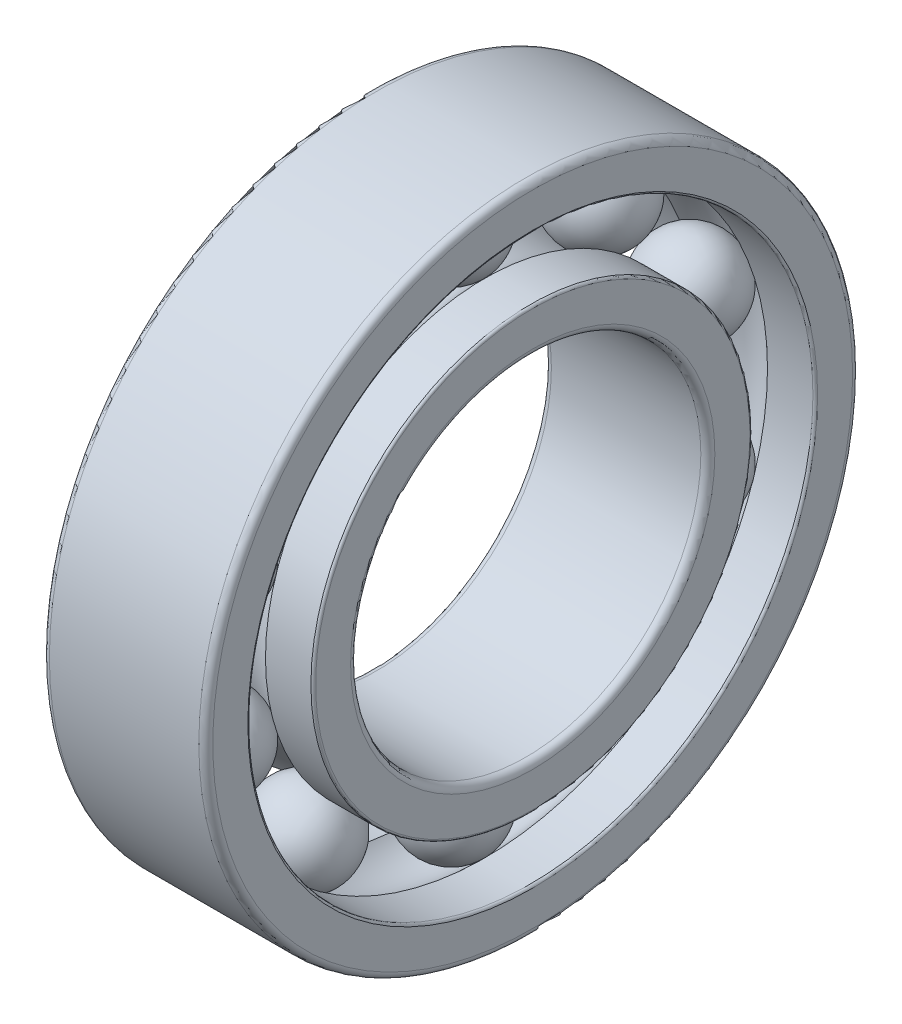
ISO-10303-21;
HEADER;
FILE_DESCRIPTION(('STEP AP214'),'2;1');
FILE_NAME('part.step','',(''),(''),'','','');
FILE_SCHEMA(('AUTOMOTIVE_DESIGN { 1 0 10303 214 1 1 1 1 }'));
ENDSEC;
DATA;
#1=APPLICATION_CONTEXT('core data for automotive mechanical design processes');
#2=APPLICATION_PROTOCOL_DEFINITION('international standard','automotive_design',2000,#1);
#3=PRODUCT_CONTEXT('',#1,'mechanical');
#4=PRODUCT('Part','Part','',(#3));
#5=PRODUCT_RELATED_PRODUCT_CATEGORY('part','',(#4));
#6=PRODUCT_DEFINITION_FORMATION('','',#4);
#7=PRODUCT_DEFINITION_CONTEXT('part definition',#1,'design');
#8=PRODUCT_DEFINITION('design','',#6,#7);
#9=PRODUCT_DEFINITION_SHAPE('','',#8);
#10=(LENGTH_UNIT() NAMED_UNIT(*) SI_UNIT(.MILLI.,.METRE.));
#11=(NAMED_UNIT(*) PLANE_ANGLE_UNIT() SI_UNIT($,.RADIAN.));
#12=(NAMED_UNIT(*) SI_UNIT($,.STERADIAN.) SOLID_ANGLE_UNIT());
#13=UNCERTAINTY_MEASURE_WITH_UNIT(LENGTH_MEASURE(1.E-05),#10,'distance_accuracy_value','');
#14=(GEOMETRIC_REPRESENTATION_CONTEXT(3) GLOBAL_UNCERTAINTY_ASSIGNED_CONTEXT((#13)) GLOBAL_UNIT_ASSIGNED_CONTEXT((#10,
#11,#12)) REPRESENTATION_CONTEXT('',''));
#15=CARTESIAN_POINT('',(0.,0.,0.));
#16=DIRECTION('',(0.,0.,1.));
#17=DIRECTION('',(1.,0.,0.));
#18=AXIS2_PLACEMENT_3D('',#15,#16,#17);
#19=CARTESIAN_POINT('',(3.5,8.696932689531,-6.3186914621441));
#20=DIRECTION('',(-1.,0.,0.));
#21=DIRECTION('',(0.,-1.,0.));
#22=AXIS2_PLACEMENT_3D('',#19,#20,#21);
#23=SPHERICAL_SURFACE('',#22,1.9845);
#24=CARTESIAN_POINT('',(1.5155,8.696932689531,-6.3186914621441));
#25=VERTEX_POINT('',#24);
#26=VERTEX_LOOP('',#25);
#27=FACE_BOUND('',#26,.T.);
#28=ADVANCED_FACE('P0_F13',(#27),#23,.T.);
#29=CLOSED_SHELL('',(#28));
#30=MANIFOLD_SOLID_BREP('P0_B1',#29);
#31=CARTESIAN_POINT('',(3.5,10.75,0.));
#32=DIRECTION('',(-1.,0.,0.));
#33=DIRECTION('',(0.,-1.,0.));
#34=AXIS2_PLACEMENT_3D('',#31,#32,#33);
#35=SPHERICAL_SURFACE('',#34,1.9845);
#36=CARTESIAN_POINT('',(1.5155,10.75,0.));
#37=VERTEX_POINT('',#36);
#38=VERTEX_LOOP('',#37);
#39=FACE_BOUND('',#38,.T.);
#40=ADVANCED_FACE('P1_F13',(#39),#35,.T.);
#41=CLOSED_SHELL('',(#40));
#42=MANIFOLD_SOLID_BREP('P1_B1',#41);
#43=CARTESIAN_POINT('',(3.5,3.321932689531,-10.223857550173));
#44=DIRECTION('',(-1.,0.,0.));
#45=DIRECTION('',(0.,-1.,0.));
#46=AXIS2_PLACEMENT_3D('',#43,#44,#45);
#47=SPHERICAL_SURFACE('',#46,1.9845);
#48=CARTESIAN_POINT('',(1.5155,3.321932689531,-10.223857550173));
#49=VERTEX_POINT('',#48);
#50=VERTEX_LOOP('',#49);
#51=FACE_BOUND('',#50,.T.);
#52=ADVANCED_FACE('P2_F13',(#51),#47,.T.);
#53=CLOSED_SHELL('',(#52));
#54=MANIFOLD_SOLID_BREP('P2_B1',#53);
#55=CARTESIAN_POINT('',(3.5,-3.3219326895307,-10.223857550173));
#56=DIRECTION('',(-1.,0.,0.));
#57=DIRECTION('',(0.,-1.,0.));
#58=AXIS2_PLACEMENT_3D('',#55,#56,#57);
#59=SPHERICAL_SURFACE('',#58,1.9845);
#60=CARTESIAN_POINT('',(1.5155,-3.3219326895307,-10.223857550173));
#61=VERTEX_POINT('',#60);
#62=VERTEX_LOOP('',#61);
#63=FACE_BOUND('',#62,.T.);
#64=ADVANCED_FACE('P3_F13',(#63),#59,.T.);
#65=CLOSED_SHELL('',(#64));
#66=MANIFOLD_SOLID_BREP('P3_B1',#65);
#67=CARTESIAN_POINT('',(3.5,-8.6969326895307,-6.3186914621441));
#68=DIRECTION('',(-1.,0.,0.));
#69=DIRECTION('',(0.,-1.,0.));
#70=AXIS2_PLACEMENT_3D('',#67,#68,#69);
#71=SPHERICAL_SURFACE('',#70,1.9845);
#72=CARTESIAN_POINT('',(1.5155,-8.6969326895307,-6.3186914621441));
#73=VERTEX_POINT('',#72);
#74=VERTEX_LOOP('',#73);
#75=FACE_BOUND('',#74,.T.);
#76=ADVANCED_FACE('P4_F13',(#75),#71,.T.);
#77=CLOSED_SHELL('',(#76));
#78=MANIFOLD_SOLID_BREP('P4_B1',#77);
#79=CARTESIAN_POINT('',(3.5,-10.75,0.));
#80=DIRECTION('',(-1.,0.,0.));
#81=DIRECTION('',(0.,-1.,0.));
#82=AXIS2_PLACEMENT_3D('',#79,#80,#81);
#83=SPHERICAL_SURFACE('',#82,1.9845);
#84=CARTESIAN_POINT('',(1.5155,-10.75,0.));
#85=VERTEX_POINT('',#84);
#86=VERTEX_LOOP('',#85);
#87=FACE_BOUND('',#86,.T.);
#88=ADVANCED_FACE('P5_F13',(#87),#83,.T.);
#89=CLOSED_SHELL('',(#88));
#90=MANIFOLD_SOLID_BREP('P5_B1',#89);
#91=CARTESIAN_POINT('',(3.5,-8.6969326895307,6.3186914621441));
#92=DIRECTION('',(-1.,0.,0.));
#93=DIRECTION('',(0.,-1.,0.));
#94=AXIS2_PLACEMENT_3D('',#91,#92,#93);
#95=SPHERICAL_SURFACE('',#94,1.9845);
#96=CARTESIAN_POINT('',(1.5155,-8.6969326895307,6.3186914621441));
#97=VERTEX_POINT('',#96);
#98=VERTEX_LOOP('',#97);
#99=FACE_BOUND('',#98,.T.);
#100=ADVANCED_FACE('P6_F13',(#99),#95,.T.);
#101=CLOSED_SHELL('',(#100));
#102=MANIFOLD_SOLID_BREP('P6_B1',#101);
#103=CARTESIAN_POINT('',(3.5,-3.3219326895307,10.223857550173));
#104=DIRECTION('',(-1.,0.,0.));
#105=DIRECTION('',(0.,-1.,0.));
#106=AXIS2_PLACEMENT_3D('',#103,#104,#105);
#107=SPHERICAL_SURFACE('',#106,1.9845);
#108=CARTESIAN_POINT('',(1.5155,-3.3219326895307,10.223857550173));
#109=VERTEX_POINT('',#108);
#110=VERTEX_LOOP('',#109);
#111=FACE_BOUND('',#110,.T.);
#112=ADVANCED_FACE('P7_F13',(#111),#107,.T.);
#113=CLOSED_SHELL('',(#112));
#114=MANIFOLD_SOLID_BREP('P7_B1',#113);
#115=CARTESIAN_POINT('',(3.5,3.321932689531,10.223857550173));
#116=DIRECTION('',(-1.,0.,0.));
#117=DIRECTION('',(0.,-1.,0.));
#118=AXIS2_PLACEMENT_3D('',#115,#116,#117);
#119=SPHERICAL_SURFACE('',#118,1.9845);
#120=CARTESIAN_POINT('',(1.5155,3.321932689531,10.223857550173));
#121=VERTEX_POINT('',#120);
#122=VERTEX_LOOP('',#121);
#123=FACE_BOUND('',#122,.T.);
#124=ADVANCED_FACE('P8_F13',(#123),#119,.T.);
#125=CLOSED_SHELL('',(#124));
#126=MANIFOLD_SOLID_BREP('P8_B1',#125);
#127=CARTESIAN_POINT('',(3.5,8.696932689531,6.3186914621441));
#128=DIRECTION('',(-1.,0.,0.));
#129=DIRECTION('',(0.,-1.,0.));
#130=AXIS2_PLACEMENT_3D('',#127,#128,#129);
#131=SPHERICAL_SURFACE('',#130,1.9845);
#132=CARTESIAN_POINT('',(1.5155,8.696932689531,6.3186914621441));
#133=VERTEX_POINT('',#132);
#134=VERTEX_LOOP('',#133);
#135=FACE_BOUND('',#134,.T.);
#136=ADVANCED_FACE('P9_F13',(#135),#131,.T.);
#137=CLOSED_SHELL('',(#136));
#138=MANIFOLD_SOLID_BREP('P9_B1',#137);
#139=CARTESIAN_POINT('',(0.,9.55411280622692,9.3));
#140=DIRECTION('',(-1.,0.,0.));
#141=DIRECTION('',(0.,0.,-1.));
#142=AXIS2_PLACEMENT_3D('',#139,#140,#141);
#143=PLANE('',#142);
#144=CARTESIAN_POINT('',(0.,0.,0.));
#145=DIRECTION('',(-1.,0.,0.));
#146=DIRECTION('',(0.,0.,1.));
#147=AXIS2_PLACEMENT_3D('',#144,#145,#146);
#148=CIRCLE('',#147,9.3);
#149=CARTESIAN_POINT('',(0.,0.,9.3));
#150=VERTEX_POINT('',#149);
#151=EDGE_CURVE('P10_E49',#150,#150,#148,.F.);
#152=ORIENTED_EDGE('',*,*,#151,.F.);
#153=EDGE_LOOP('',(#152));
#154=FACE_BOUND('',#153,.T.);
#155=CARTESIAN_POINT('',(0.,0.,0.));
#156=DIRECTION('',(1.,0.,0.));
#157=DIRECTION('',(0.,0.,-1.));
#158=AXIS2_PLACEMENT_3D('',#155,#156,#157);
#159=CIRCLE('',#158,7.80000001843172);
#160=CARTESIAN_POINT('',(0.,0.,-7.80000001843172));
#161=VERTEX_POINT('',#160);
#162=EDGE_CURVE('P10_E46',#161,#161,#159,.T.);
#163=ORIENTED_EDGE('',*,*,#162,.T.);
#164=EDGE_LOOP('',(#163));
#165=FACE_BOUND('',#164,.T.);
#166=ADVANCED_FACE('P10_F14',(#154,#165),#143,.T.);
#167=CARTESIAN_POINT('',(7.,9.5541127903656,-9.3));
#168=DIRECTION('',(1.,0.,0.));
#169=DIRECTION('',(0.,0.,1.));
#170=AXIS2_PLACEMENT_3D('',#167,#168,#169);
#171=PLANE('',#170);
#172=CARTESIAN_POINT('',(7.,0.,0.));
#173=DIRECTION('',(1.,0.,0.));
#174=DIRECTION('',(0.,1.16850949466034E-09,-1.));
#175=AXIS2_PLACEMENT_3D('',#172,#173,#174);
#176=CIRCLE('',#175,9.3);
#177=CARTESIAN_POINT('',(7.,1.08671383003411E-08,-9.3));
#178=VERTEX_POINT('',#177);
#179=EDGE_CURVE('P10_E43',#178,#178,#176,.T.);
#180=ORIENTED_EDGE('',*,*,#179,.T.);
#181=EDGE_LOOP('',(#180));
#182=FACE_BOUND('',#181,.T.);
#183=CARTESIAN_POINT('',(7.,0.,0.));
#184=DIRECTION('',(-1.,0.,0.));
#185=DIRECTION('',(0.,0.,1.));
#186=AXIS2_PLACEMENT_3D('',#183,#184,#185);
#187=CIRCLE('',#186,7.8);
#188=CARTESIAN_POINT('',(7.,0.,7.8));
#189=VERTEX_POINT('',#188);
#190=EDGE_CURVE('P10_E40',#189,#189,#187,.F.);
#191=ORIENTED_EDGE('',*,*,#190,.F.);
#192=EDGE_LOOP('',(#191));
#193=FACE_BOUND('',#192,.T.);
#194=ADVANCED_FACE('P10_F57',(#182,#193),#171,.T.);
#195=CARTESIAN_POINT('',(0.299999999999939,0.,0.));
#196=DIRECTION('',(1.,0.,0.));
#197=DIRECTION('',(0.,0.,-1.));
#198=AXIS2_PLACEMENT_3D('',#195,#196,#197);
#199=TOROIDAL_SURFACE('',#198,7.8,0.299999999999939);
#200=CARTESIAN_POINT('',(0.299999999999994,0.,0.));
#201=DIRECTION('',(1.,0.,0.));
#202=DIRECTION('',(0.,0.,-1.));
#203=AXIS2_PLACEMENT_3D('',#200,#201,#202);
#204=CIRCLE('',#203,7.50000000000006);
#205=CARTESIAN_POINT('',(0.299999999999994,0.,-7.50000000000006));
#206=VERTEX_POINT('',#205);
#207=EDGE_CURVE('P10_E37',#206,#206,#204,.T.);
#208=ORIENTED_EDGE('',*,*,#207,.T.);
#209=EDGE_LOOP('',(#208));
#210=FACE_BOUND('',#209,.T.);
#211=ORIENTED_EDGE('',*,*,#162,.F.);
#212=EDGE_LOOP('',(#211));
#213=FACE_BOUND('',#212,.T.);
#214=ADVANCED_FACE('P10_F61',(#210,#213),#199,.T.);
#215=CARTESIAN_POINT('',(100.,0.,0.));
#216=DIRECTION('',(1.,0.,0.));
#217=DIRECTION('',(0.,0.,-1.));
#218=AXIS2_PLACEMENT_3D('',#215,#216,#217);
#219=CYLINDRICAL_SURFACE('',#218,7.5);
#220=CARTESIAN_POINT('',(6.7,0.,0.));
#221=DIRECTION('',(1.,0.,0.));
#222=DIRECTION('',(0.,0.,-1.));
#223=AXIS2_PLACEMENT_3D('',#220,#221,#222);
#224=CIRCLE('',#223,7.5);
#225=CARTESIAN_POINT('',(6.7,0.,-7.5));
#226=VERTEX_POINT('',#225);
#227=EDGE_CURVE('P10_E34',#226,#226,#224,.T.);
#228=ORIENTED_EDGE('',*,*,#227,.T.);
#229=EDGE_LOOP('',(#228));
#230=FACE_BOUND('',#229,.T.);
#231=ORIENTED_EDGE('',*,*,#207,.F.);
#232=EDGE_LOOP('',(#231));
#233=FACE_BOUND('',#232,.T.);
#234=ADVANCED_FACE('P10_F63',(#230,#233),#219,.F.);
#235=CARTESIAN_POINT('',(6.70000000000012,0.,0.));
#236=DIRECTION('',(1.,0.,0.));
#237=DIRECTION('',(0.,0.,-1.));
#238=AXIS2_PLACEMENT_3D('',#235,#236,#237);
#239=TOROIDAL_SURFACE('',#238,7.79999999999988,0.299999999999877);
#240=ORIENTED_EDGE('',*,*,#190,.T.);
#241=EDGE_LOOP('',(#240));
#242=FACE_BOUND('',#241,.T.);
#243=ORIENTED_EDGE('',*,*,#227,.F.);
#244=EDGE_LOOP('',(#243));
#245=FACE_BOUND('',#244,.T.);
#246=ADVANCED_FACE('P10_F71',(#242,#245),#239,.T.);
#247=CARTESIAN_POINT('',(6.90000000000015,0.,0.));
#248=DIRECTION('',(1.,0.,0.));
#249=DIRECTION('',(0.,0.,-1.));
#250=AXIS2_PLACEMENT_3D('',#247,#248,#249);
#251=TOROIDAL_SURFACE('',#250,9.30000000000015,0.0999999999998467);
#252=CARTESIAN_POINT('',(6.90000000000015,0.,0.));
#253=DIRECTION('',(1.,0.,0.));
#254=DIRECTION('',(0.,0.,-1.));
#255=AXIS2_PLACEMENT_3D('',#252,#253,#254);
#256=CIRCLE('',#255,9.4);
#257=CARTESIAN_POINT('',(6.90000000000015,0.,-9.4));
#258=VERTEX_POINT('',#257);
#259=EDGE_CURVE('P10_E29',#258,#258,#256,.T.);
#260=ORIENTED_EDGE('',*,*,#259,.T.);
#261=EDGE_LOOP('',(#260));
#262=FACE_BOUND('',#261,.T.);
#263=ORIENTED_EDGE('',*,*,#179,.F.);
#264=EDGE_LOOP('',(#263));
#265=FACE_BOUND('',#264,.T.);
#266=ADVANCED_FACE('P10_F79',(#262,#265),#251,.T.);
#267=CARTESIAN_POINT('',(100.,0.,0.));
#268=DIRECTION('',(1.,0.,0.));
#269=DIRECTION('',(0.,0.,-1.));
#270=AXIS2_PLACEMENT_3D('',#267,#268,#269);
#271=CYLINDRICAL_SURFACE('',#270,9.4);
#272=CARTESIAN_POINT('',(4.95455843815231,0.,0.));
#273=DIRECTION('',(1.,0.,0.));
#274=DIRECTION('',(0.,0.,-1.));
#275=AXIS2_PLACEMENT_3D('',#272,#273,#274);
#276=CIRCLE('',#275,9.4);
#277=CARTESIAN_POINT('',(4.95455843815231,0.,-9.4));
#278=VERTEX_POINT('',#277);
#279=EDGE_CURVE('P10_E25',#278,#278,#276,.T.);
#280=ORIENTED_EDGE('',*,*,#279,.T.);
#281=EDGE_LOOP('',(#280));
#282=FACE_BOUND('',#281,.T.);
#283=ORIENTED_EDGE('',*,*,#259,.F.);
#284=EDGE_LOOP('',(#283));
#285=FACE_BOUND('',#284,.T.);
#286=ADVANCED_FACE('P10_F83',(#282,#285),#271,.T.);
#287=CARTESIAN_POINT('',(3.5,0.,0.));
#288=DIRECTION('',(1.,0.,0.));
#289=DIRECTION('',(0.,0.,-1.));
#290=AXIS2_PLACEMENT_3D('',#287,#288,#289);
#291=TOROIDAL_SURFACE('',#290,10.75,1.98450000000004);
#292=ORIENTED_EDGE('',*,*,#279,.F.);
#293=EDGE_LOOP('',(#292));
#294=FACE_BOUND('',#293,.T.);
#295=CARTESIAN_POINT('',(2.04544156184768,0.,0.));
#296=DIRECTION('',(1.,0.,0.));
#297=DIRECTION('',(0.,0.,-1.));
#298=AXIS2_PLACEMENT_3D('',#295,#296,#297);
#299=CIRCLE('',#298,9.39999999999998);
#300=CARTESIAN_POINT('',(2.04544156184768,0.,-9.39999999999998));
#301=VERTEX_POINT('',#300);
#302=EDGE_CURVE('P10_E21',#301,#301,#299,.T.);
#303=ORIENTED_EDGE('',*,*,#302,.T.);
#304=EDGE_LOOP('',(#303));
#305=FACE_BOUND('',#304,.T.);
#306=ADVANCED_FACE('P10_F87',(#294,#305),#291,.F.);
#307=CARTESIAN_POINT('',(100.,0.,0.));
#308=DIRECTION('',(1.,0.,0.));
#309=DIRECTION('',(0.,0.,-1.));
#310=AXIS2_PLACEMENT_3D('',#307,#308,#309);
#311=CYLINDRICAL_SURFACE('',#310,9.4);
#312=CARTESIAN_POINT('',(0.100000000000009,0.,0.));
#313=DIRECTION('',(1.,0.,0.));
#314=DIRECTION('',(0.,0.,-1.));
#315=AXIS2_PLACEMENT_3D('',#312,#313,#314);
#316=CIRCLE('',#315,9.4);
#317=CARTESIAN_POINT('',(0.100000000000009,0.,-9.4));
#318=VERTEX_POINT('',#317);
#319=EDGE_CURVE('P10_E9',#318,#318,#316,.T.);
#320=ORIENTED_EDGE('',*,*,#319,.T.);
#321=EDGE_LOOP('',(#320));
#322=FACE_BOUND('',#321,.T.);
#323=ORIENTED_EDGE('',*,*,#302,.F.);
#324=EDGE_LOOP('',(#323));
#325=FACE_BOUND('',#324,.T.);
#326=ADVANCED_FACE('P10_F90',(#322,#325),#311,.T.);
#327=CARTESIAN_POINT('',(0.0999999999999242,0.,0.));
#328=DIRECTION('',(1.,0.,0.));
#329=DIRECTION('',(0.,0.,-1.));
#330=AXIS2_PLACEMENT_3D('',#327,#328,#329);
#331=TOROIDAL_SURFACE('',#330,9.3,0.0999999999999231);
#332=ORIENTED_EDGE('',*,*,#151,.T.);
#333=EDGE_LOOP('',(#332));
#334=FACE_BOUND('',#333,.T.);
#335=ORIENTED_EDGE('',*,*,#319,.F.);
#336=EDGE_LOOP('',(#335));
#337=FACE_BOUND('',#336,.T.);
#338=ADVANCED_FACE('P10_F16',(#334,#337),#331,.T.);
#339=CLOSED_SHELL('',(#166,#194,#214,#234,#246,#266,#286,#306,#326,#338));
#340=MANIFOLD_SOLID_BREP('P10_B1',#339);
#341=CARTESIAN_POINT('',(0.,13.9544959092762,13.7));
#342=DIRECTION('',(-1.,0.,0.));
#343=DIRECTION('',(0.,0.,-1.));
#344=AXIS2_PLACEMENT_3D('',#341,#342,#343);
#345=PLANE('',#344);
#346=CARTESIAN_POINT('',(0.,0.,0.));
#347=DIRECTION('',(-1.,0.,0.));
#348=DIRECTION('',(0.,0.,1.));
#349=AXIS2_PLACEMENT_3D('',#346,#347,#348);
#350=CIRCLE('',#349,13.7);
#351=CARTESIAN_POINT('',(0.,0.,13.7));
#352=VERTEX_POINT('',#351);
#353=EDGE_CURVE('P11_E50',#352,#352,#350,.F.);
#354=ORIENTED_EDGE('',*,*,#353,.F.);
#355=EDGE_LOOP('',(#354));
#356=FACE_BOUND('',#355,.T.);
#357=CARTESIAN_POINT('',(0.,0.,0.));
#358=DIRECTION('',(1.,0.,0.));
#359=DIRECTION('',(0.,0.,-1.));
#360=AXIS2_PLACEMENT_3D('',#357,#358,#359);
#361=CIRCLE('',#360,12.1999999999994);
#362=CARTESIAN_POINT('',(0.,0.,-12.1999999999994));
#363=VERTEX_POINT('',#362);
#364=EDGE_CURVE('P11_E47',#363,#363,#361,.T.);
#365=ORIENTED_EDGE('',*,*,#364,.T.);
#366=EDGE_LOOP('',(#365));
#367=FACE_BOUND('',#366,.T.);
#368=ADVANCED_FACE('P11_F15',(#356,#367),#345,.T.);
#369=CARTESIAN_POINT('',(7.,13.9544959092762,-13.7));
#370=DIRECTION('',(1.,0.,0.));
#371=DIRECTION('',(0.,0.,1.));
#372=AXIS2_PLACEMENT_3D('',#369,#370,#371);
#373=PLANE('',#372);
#374=CARTESIAN_POINT('',(7.,0.,0.));
#375=DIRECTION('',(1.,0.,0.));
#376=DIRECTION('',(0.,0.,-1.));
#377=AXIS2_PLACEMENT_3D('',#374,#375,#376);
#378=CIRCLE('',#377,13.7);
#379=CARTESIAN_POINT('',(7.,0.,-13.7));
#380=VERTEX_POINT('',#379);
#381=EDGE_CURVE('P11_E44',#380,#380,#378,.T.);
#382=ORIENTED_EDGE('',*,*,#381,.T.);
#383=EDGE_LOOP('',(#382));
#384=FACE_BOUND('',#383,.T.);
#385=CARTESIAN_POINT('',(7.,0.,0.));
#386=DIRECTION('',(-1.,0.,0.));
#387=DIRECTION('',(0.,0.,1.));
#388=AXIS2_PLACEMENT_3D('',#385,#386,#387);
#389=CIRCLE('',#388,12.2000000258519);
#390=CARTESIAN_POINT('',(7.,0.,12.2000000258519));
#391=VERTEX_POINT('',#390);
#392=EDGE_CURVE('P11_E41',#391,#391,#389,.F.);
#393=ORIENTED_EDGE('',*,*,#392,.F.);
#394=EDGE_LOOP('',(#393));
#395=FACE_BOUND('',#394,.T.);
#396=ADVANCED_FACE('P11_F59',(#384,#395),#373,.T.);
#397=CARTESIAN_POINT('',(0.299999999999938,0.,0.));
#398=DIRECTION('',(1.,0.,0.));
#399=DIRECTION('',(0.,-1.92336047429162E-10,-1.));
#400=AXIS2_PLACEMENT_3D('',#397,#398,#399);
#401=TOROIDAL_SURFACE('',#400,13.7,0.299999999999938);
#402=ORIENTED_EDGE('',*,*,#353,.T.);
#403=EDGE_LOOP('',(#402));
#404=FACE_BOUND('',#403,.T.);
#405=CARTESIAN_POINT('',(0.299999999999938,0.,0.));
#406=DIRECTION('',(-1.,0.,0.));
#407=DIRECTION('',(0.,0.,1.));
#408=AXIS2_PLACEMENT_3D('',#405,#406,#407);
#409=CIRCLE('',#408,13.9999999999999);
#410=CARTESIAN_POINT('',(0.299999999999938,0.,13.9999999999999));
#411=VERTEX_POINT('',#410);
#412=EDGE_CURVE('P11_E38',#411,#411,#409,.F.);
#413=ORIENTED_EDGE('',*,*,#412,.F.);
#414=EDGE_LOOP('',(#413));
#415=FACE_BOUND('',#414,.T.);
#416=ADVANCED_FACE('P11_F54',(#404,#415),#401,.T.);
#417=CARTESIAN_POINT('',(0.099999999999411,0.,0.));
#418=DIRECTION('',(1.,0.,0.));
#419=DIRECTION('',(0.,0.,-1.));
#420=AXIS2_PLACEMENT_3D('',#417,#418,#419);
#421=TOROIDAL_SURFACE('',#420,12.1999999999994,0.099999999999411);
#422=CARTESIAN_POINT('',(0.100000000000003,0.,0.));
#423=DIRECTION('',(1.,0.,0.));
#424=DIRECTION('',(0.,0.,-1.));
#425=AXIS2_PLACEMENT_3D('',#422,#423,#424);
#426=CIRCLE('',#425,12.1);
#427=CARTESIAN_POINT('',(0.100000000000003,0.,-12.1));
#428=VERTEX_POINT('',#427);
#429=EDGE_CURVE('P11_E35',#428,#428,#426,.T.);
#430=ORIENTED_EDGE('',*,*,#429,.T.);
#431=EDGE_LOOP('',(#430));
#432=FACE_BOUND('',#431,.T.);
#433=ORIENTED_EDGE('',*,*,#364,.F.);
#434=EDGE_LOOP('',(#433));
#435=FACE_BOUND('',#434,.T.);
#436=ADVANCED_FACE('P11_F63',(#432,#435),#421,.T.);
#437=CARTESIAN_POINT('',(50.,0.,0.));
#438=DIRECTION('',(1.,0.,0.));
#439=DIRECTION('',(0.,0.,-1.));
#440=AXIS2_PLACEMENT_3D('',#437,#438,#439);
#441=CYLINDRICAL_SURFACE('',#440,12.1);
#442=CARTESIAN_POINT('',(2.0454415618477,0.,0.));
#443=DIRECTION('',(1.,0.,0.));
#444=DIRECTION('',(0.,1.92351789711357E-10,-1.));
#445=AXIS2_PLACEMENT_3D('',#442,#443,#444);
#446=CIRCLE('',#445,12.1);
#447=CARTESIAN_POINT('',(2.0454415618477,2.32745665550741E-09,-12.1));
#448=VERTEX_POINT('',#447);
#449=EDGE_CURVE('P11_E30',#448,#448,#446,.T.);
#450=ORIENTED_EDGE('',*,*,#449,.T.);
#451=EDGE_LOOP('',(#450));
#452=FACE_BOUND('',#451,.T.);
#453=ORIENTED_EDGE('',*,*,#429,.F.);
#454=EDGE_LOOP('',(#453));
#455=FACE_BOUND('',#454,.T.);
#456=ADVANCED_FACE('P11_F65',(#452,#455),#441,.F.);
#457=CARTESIAN_POINT('',(3.5,0.,0.));
#458=DIRECTION('',(1.,0.,0.));
#459=DIRECTION('',(0.,0.,-1.));
#460=AXIS2_PLACEMENT_3D('',#457,#458,#459);
#461=TOROIDAL_SURFACE('',#460,10.75,1.98450000000004);
#462=ORIENTED_EDGE('',*,*,#449,.F.);
#463=EDGE_LOOP('',(#462));
#464=FACE_BOUND('',#463,.T.);
#465=CARTESIAN_POINT('',(4.95455843815232,0.,0.));
#466=DIRECTION('',(1.,0.,0.));
#467=DIRECTION('',(0.,0.,-1.));
#468=AXIS2_PLACEMENT_3D('',#465,#466,#467);
#469=CIRCLE('',#468,12.1);
#470=CARTESIAN_POINT('',(4.95455843815232,0.,-12.1));
#471=VERTEX_POINT('',#470);
#472=EDGE_CURVE('P11_E26',#471,#471,#469,.T.);
#473=ORIENTED_EDGE('',*,*,#472,.T.);
#474=EDGE_LOOP('',(#473));
#475=FACE_BOUND('',#474,.T.);
#476=ADVANCED_FACE('P11_F73',(#464,#475),#461,.F.);
#477=CARTESIAN_POINT('',(50.,0.,0.));
#478=DIRECTION('',(1.,0.,0.));
#479=DIRECTION('',(0.,0.,-1.));
#480=AXIS2_PLACEMENT_3D('',#477,#478,#479);
#481=CYLINDRICAL_SURFACE('',#480,12.1);
#482=CARTESIAN_POINT('',(6.9,0.,0.));
#483=DIRECTION('',(1.,0.,0.));
#484=DIRECTION('',(0.,0.,-1.));
#485=AXIS2_PLACEMENT_3D('',#482,#483,#484);
#486=CIRCLE('',#485,12.1);
#487=CARTESIAN_POINT('',(6.9,0.,-12.1));
#488=VERTEX_POINT('',#487);
#489=EDGE_CURVE('P11_E22',#488,#488,#486,.T.);
#490=ORIENTED_EDGE('',*,*,#489,.T.);
#491=EDGE_LOOP('',(#490));
#492=FACE_BOUND('',#491,.T.);
#493=ORIENTED_EDGE('',*,*,#472,.F.);
#494=EDGE_LOOP('',(#493));
#495=FACE_BOUND('',#494,.T.);
#496=ADVANCED_FACE('P11_F81',(#492,#495),#481,.F.);
#497=CARTESIAN_POINT('',(6.90000000000067,0.,0.));
#498=DIRECTION('',(1.,0.,0.));
#499=DIRECTION('',(0.,0.,-1.));
#500=AXIS2_PLACEMENT_3D('',#497,#498,#499);
#501=TOROIDAL_SURFACE('',#500,12.1999999999993,0.0999999999993333);
#502=ORIENTED_EDGE('',*,*,#392,.T.);
#503=EDGE_LOOP('',(#502));
#504=FACE_BOUND('',#503,.T.);
#505=ORIENTED_EDGE('',*,*,#489,.F.);
#506=EDGE_LOOP('',(#505));
#507=FACE_BOUND('',#506,.T.);
#508=ADVANCED_FACE('P11_F85',(#504,#507),#501,.T.);
#509=CARTESIAN_POINT('',(6.70000000000012,0.,0.));
#510=DIRECTION('',(1.,0.,0.));
#511=DIRECTION('',(0.,0.,-1.));
#512=AXIS2_PLACEMENT_3D('',#509,#510,#511);
#513=TOROIDAL_SURFACE('',#512,13.7000000000001,0.299999999999877);
#514=CARTESIAN_POINT('',(6.70000000000012,0.,0.));
#515=DIRECTION('',(1.,0.,0.));
#516=DIRECTION('',(0.,0.,-1.));
#517=AXIS2_PLACEMENT_3D('',#514,#515,#516);
#518=CIRCLE('',#517,14.);
#519=CARTESIAN_POINT('',(6.70000000000012,0.,-14.));
#520=VERTEX_POINT('',#519);
#521=EDGE_CURVE('P11_E10',#520,#520,#518,.T.);
#522=ORIENTED_EDGE('',*,*,#521,.T.);
#523=EDGE_LOOP('',(#522));
#524=FACE_BOUND('',#523,.T.);
#525=ORIENTED_EDGE('',*,*,#381,.F.);
#526=EDGE_LOOP('',(#525));
#527=FACE_BOUND('',#526,.T.);
#528=ADVANCED_FACE('P11_F87',(#524,#527),#513,.T.);
#529=CARTESIAN_POINT('',(50.,0.,0.));
#530=DIRECTION('',(1.,0.,0.));
#531=DIRECTION('',(0.,-1.92336047429162E-10,-1.));
#532=AXIS2_PLACEMENT_3D('',#529,#530,#531);
#533=CYLINDRICAL_SURFACE('',#532,14.);
#534=ORIENTED_EDGE('',*,*,#412,.T.);
#535=EDGE_LOOP('',(#534));
#536=FACE_BOUND('',#535,.T.);
#537=ORIENTED_EDGE('',*,*,#521,.F.);
#538=EDGE_LOOP('',(#537));
#539=FACE_BOUND('',#538,.T.);
#540=ADVANCED_FACE('P11_F17',(#536,#539),#533,.T.);
#541=CLOSED_SHELL('',(#368,#396,#416,#436,#456,#476,#496,#508,#528,#540));
#542=MANIFOLD_SOLID_BREP('P11_B1',#541);
#543=ADVANCED_BREP_SHAPE_REPRESENTATION('',(#18,#30,#42,#54,#66,#78,#90,#102,#114,#126,#138,
#340,#542),#14);
#544=SHAPE_DEFINITION_REPRESENTATION(#9,#543);
ENDSEC;
END-ISO-10303-21;
